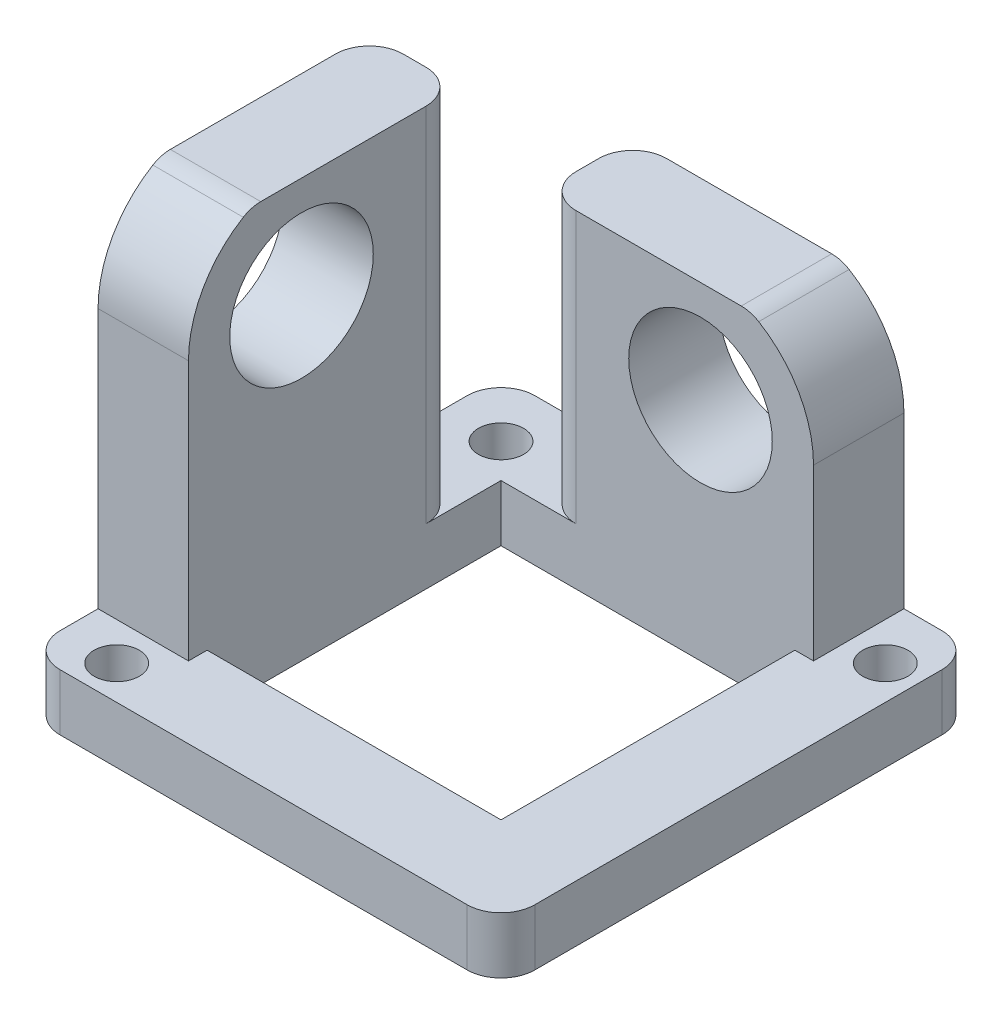
ISO-10303-21;
HEADER;
FILE_DESCRIPTION(('STEP AP214'),'2;1');
FILE_NAME('part.step','',(''),(''),'','','');
FILE_SCHEMA(('AUTOMOTIVE_DESIGN { 1 0 10303 214 1 1 1 1 }'));
ENDSEC;
DATA;
#1=APPLICATION_CONTEXT('core data for automotive mechanical design processes');
#2=APPLICATION_PROTOCOL_DEFINITION('international standard','automotive_design',2000,#1);
#3=PRODUCT_CONTEXT('',#1,'mechanical');
#4=PRODUCT('Part','Part','',(#3));
#5=PRODUCT_RELATED_PRODUCT_CATEGORY('part','',(#4));
#6=PRODUCT_DEFINITION_FORMATION('','',#4);
#7=PRODUCT_DEFINITION_CONTEXT('part definition',#1,'design');
#8=PRODUCT_DEFINITION('design','',#6,#7);
#9=PRODUCT_DEFINITION_SHAPE('','',#8);
#10=(LENGTH_UNIT() NAMED_UNIT(*) SI_UNIT(.MILLI.,.METRE.));
#11=(NAMED_UNIT(*) PLANE_ANGLE_UNIT() SI_UNIT($,.RADIAN.));
#12=(NAMED_UNIT(*) SI_UNIT($,.STERADIAN.) SOLID_ANGLE_UNIT());
#13=UNCERTAINTY_MEASURE_WITH_UNIT(LENGTH_MEASURE(1.E-05),#10,'distance_accuracy_value','');
#14=(GEOMETRIC_REPRESENTATION_CONTEXT(3) GLOBAL_UNCERTAINTY_ASSIGNED_CONTEXT((#13)) GLOBAL_UNIT_ASSIGNED_CONTEXT((#10,
#11,#12)) REPRESENTATION_CONTEXT('',''));
#15=CARTESIAN_POINT('',(0.,0.,0.));
#16=DIRECTION('',(0.,0.,1.));
#17=DIRECTION('',(1.,0.,0.));
#18=AXIS2_PLACEMENT_3D('',#15,#16,#17);
#19=CARTESIAN_POINT('',(0.,5.,-3.00000000000002));
#20=DIRECTION('',(1.,0.,0.));
#21=DIRECTION('',(0.,0.,-1.));
#22=AXIS2_PLACEMENT_3D('',#19,#20,#21);
#23=PLANE('',#22);
#24=CARTESIAN_POINT('',(0.,28.,-16.35));
#25=DIRECTION('',(1.,0.,0.));
#26=DIRECTION('',(0.,0.,-1.));
#27=AXIS2_PLACEMENT_3D('',#24,#25,#26);
#28=CIRCLE('',#27,6.35);
#29=CARTESIAN_POINT('',(0.,28.,-22.7));
#30=VERTEX_POINT('',#29);
#31=EDGE_CURVE('E534',#30,#30,#28,.F.);
#32=ORIENTED_EDGE('',*,*,#31,.F.);
#33=EDGE_LOOP('',(#32));
#34=FACE_BOUND('',#33,.T.);
#35=CARTESIAN_POINT('',(0.,28.,-16.35));
#36=DIRECTION('',(1.,0.,0.));
#37=DIRECTION('',(0.,0.,-1.));
#38=AXIS2_PLACEMENT_3D('',#35,#36,#37);
#39=CIRCLE('',#38,10.);
#40=CARTESIAN_POINT('',(0.,28.,-6.34999999999999));
#41=VERTEX_POINT('',#40);
#42=CARTESIAN_POINT('',(0.,36.5714285714286,-11.1992124636229));
#43=VERTEX_POINT('',#42);
#44=EDGE_CURVE('E255',#41,#43,#39,.F.);
#45=ORIENTED_EDGE('',*,*,#44,.T.);
#46=CARTESIAN_POINT('',(0.,34.,-12.744448724536));
#47=DIRECTION('',(1.,0.,0.));
#48=DIRECTION('',(0.,0.,-1.));
#49=AXIS2_PLACEMENT_3D('',#46,#47,#48);
#50=CIRCLE('',#49,3.);
#51=CARTESIAN_POINT('',(0.,37.,-12.744448724536));
#52=VERTEX_POINT('',#51);
#53=EDGE_CURVE('E444',#43,#52,#50,.F.);
#54=ORIENTED_EDGE('',*,*,#53,.T.);
#55=DIRECTION('',(0.,0.,1.));
#56=VECTOR('',#55,1.);
#57=CARTESIAN_POINT('',(0.,37.,0.));
#58=LINE('',#57,#56);
#59=CARTESIAN_POINT('',(0.,37.,-27.35));
#60=VERTEX_POINT('',#59);
#61=EDGE_CURVE('E274',#60,#52,#58,.T.);
#62=ORIENTED_EDGE('',*,*,#61,.F.);
#63=DIRECTION('',(0.,-1.,0.));
#64=VECTOR('',#63,1.);
#65=CARTESIAN_POINT('',(0.,5.,-27.35));
#66=LINE('',#65,#64);
#67=CARTESIAN_POINT('',(0.,5.,-27.35));
#68=VERTEX_POINT('',#67);
#69=EDGE_CURVE('E441',#60,#68,#66,.T.);
#70=ORIENTED_EDGE('',*,*,#69,.T.);
#71=DIRECTION('',(0.,0.,1.));
#72=VECTOR('',#71,1.);
#73=CARTESIAN_POINT('',(0.,5.,-3.00000000000002));
#74=LINE('',#73,#72);
#75=CARTESIAN_POINT('',(0.,5.,-39.));
#76=VERTEX_POINT('',#75);
#77=EDGE_CURVE('E353',#76,#68,#74,.T.);
#78=ORIENTED_EDGE('',*,*,#77,.F.);
#79=DIRECTION('',(0.,-1.,0.));
#80=VECTOR('',#79,1.);
#81=CARTESIAN_POINT('',(0.,5.,-39.));
#82=LINE('',#81,#80);
#83=CARTESIAN_POINT('',(0.,0.,-39.));
#84=VERTEX_POINT('',#83);
#85=EDGE_CURVE('E292',#76,#84,#82,.T.);
#86=ORIENTED_EDGE('',*,*,#85,.T.);
#87=DIRECTION('',(0.,0.,1.));
#88=VECTOR('',#87,1.);
#89=CARTESIAN_POINT('',(0.,0.,-3.00000000000002));
#90=LINE('',#89,#88);
#91=CARTESIAN_POINT('',(0.,0.,-3.00000000000002));
#92=VERTEX_POINT('',#91);
#93=EDGE_CURVE('E372',#84,#92,#90,.T.);
#94=ORIENTED_EDGE('',*,*,#93,.T.);
#95=DIRECTION('',(0.,-1.,0.));
#96=VECTOR('',#95,1.);
#97=CARTESIAN_POINT('',(0.,5.,-3.00000000000002));
#98=LINE('',#97,#96);
#99=CARTESIAN_POINT('',(0.,5.,-3.00000000000002));
#100=VERTEX_POINT('',#99);
#101=EDGE_CURVE('E402',#100,#92,#98,.T.);
#102=ORIENTED_EDGE('',*,*,#101,.F.);
#103=CARTESIAN_POINT('',(0.,5.,-6.34999999999999));
#104=VERTEX_POINT('',#103);
#105=EDGE_CURVE('E351',#104,#100,#74,.T.);
#106=ORIENTED_EDGE('',*,*,#105,.F.);
#107=DIRECTION('',(0.,-1.,0.));
#108=VECTOR('',#107,1.);
#109=CARTESIAN_POINT('',(0.,37.,-6.34999999999999));
#110=LINE('',#109,#108);
#111=EDGE_CURVE('E269',#41,#104,#110,.T.);
#112=ORIENTED_EDGE('',*,*,#111,.F.);
#113=EDGE_LOOP('',(#45,#54,#62,#70,#78,#86,#94,#102,#106,#112));
#114=FACE_BOUND('',#113,.T.);
#115=ADVANCED_FACE('F60',(#34,#114),#23,.F.);
#116=CARTESIAN_POINT('',(8.,5.,-34.));
#117=DIRECTION('',(1.,0.,0.));
#118=DIRECTION('',(0.,0.,-1.));
#119=AXIS2_PLACEMENT_3D('',#116,#117,#118);
#120=PLANE('',#119);
#121=CARTESIAN_POINT('',(8.,28.,-16.35));
#122=DIRECTION('',(1.,0.,0.));
#123=DIRECTION('',(0.,0.,-1.));
#124=AXIS2_PLACEMENT_3D('',#121,#122,#123);
#125=CIRCLE('',#124,6.35);
#126=CARTESIAN_POINT('',(8.,28.,-22.7));
#127=VERTEX_POINT('',#126);
#128=EDGE_CURVE('E262',#127,#127,#125,.T.);
#129=ORIENTED_EDGE('',*,*,#128,.F.);
#130=EDGE_LOOP('',(#129));
#131=FACE_BOUND('',#130,.T.);
#132=DIRECTION('',(0.,0.,1.));
#133=VECTOR('',#132,1.);
#134=CARTESIAN_POINT('',(8.,37.,0.));
#135=LINE('',#134,#133);
#136=CARTESIAN_POINT('',(8.,37.,-27.35));
#137=VERTEX_POINT('',#136);
#138=CARTESIAN_POINT('',(8.,37.,-12.744448724536));
#139=VERTEX_POINT('',#138);
#140=EDGE_CURVE('E515',#137,#139,#135,.T.);
#141=ORIENTED_EDGE('',*,*,#140,.T.);
#142=CARTESIAN_POINT('',(8.,34.,-12.744448724536));
#143=DIRECTION('',(1.,0.,0.));
#144=DIRECTION('',(0.,0.,-1.));
#145=AXIS2_PLACEMENT_3D('',#142,#143,#144);
#146=CIRCLE('',#145,3.);
#147=CARTESIAN_POINT('',(8.,36.5714285714286,-11.1992124636229));
#148=VERTEX_POINT('',#147);
#149=EDGE_CURVE('E251',#139,#148,#146,.T.);
#150=ORIENTED_EDGE('',*,*,#149,.T.);
#151=CARTESIAN_POINT('',(8.,28.,-16.35));
#152=DIRECTION('',(1.,0.,0.));
#153=DIRECTION('',(0.,0.,-1.));
#154=AXIS2_PLACEMENT_3D('',#151,#152,#153);
#155=CIRCLE('',#154,10.);
#156=CARTESIAN_POINT('',(8.00000000000001,28.,-6.34999999999999));
#157=VERTEX_POINT('',#156);
#158=EDGE_CURVE('E244',#148,#157,#155,.T.);
#159=ORIENTED_EDGE('',*,*,#158,.T.);
#160=DIRECTION('',(0.,-1.,0.));
#161=VECTOR('',#160,1.);
#162=CARTESIAN_POINT('',(8.,37.,-6.34999999999999));
#163=LINE('',#162,#161);
#164=CARTESIAN_POINT('',(8.,5.,-6.34999999999999));
#165=VERTEX_POINT('',#164);
#166=EDGE_CURVE('E249',#157,#165,#163,.T.);
#167=ORIENTED_EDGE('',*,*,#166,.T.);
#168=DIRECTION('',(0.,0.,1.));
#169=VECTOR('',#168,1.);
#170=CARTESIAN_POINT('',(8.,5.,0.));
#171=LINE('',#170,#169);
#172=CARTESIAN_POINT('',(8.,5.,-8.));
#173=VERTEX_POINT('',#172);
#174=EDGE_CURVE('E522',#173,#165,#171,.T.);
#175=ORIENTED_EDGE('',*,*,#174,.F.);
#176=DIRECTION('',(0.,-1.,0.));
#177=VECTOR('',#176,1.);
#178=CARTESIAN_POINT('',(8.,5.,-8.));
#179=LINE('',#178,#177);
#180=CARTESIAN_POINT('',(8.,0.,-8.));
#181=VERTEX_POINT('',#180);
#182=EDGE_CURVE('E326',#173,#181,#179,.T.);
#183=ORIENTED_EDGE('',*,*,#182,.T.);
#184=DIRECTION('',(0.,0.,1.));
#185=VECTOR('',#184,1.);
#186=CARTESIAN_POINT('',(8.,0.,-34.));
#187=LINE('',#186,#185);
#188=CARTESIAN_POINT('',(8.,0.,-34.));
#189=VERTEX_POINT('',#188);
#190=EDGE_CURVE('E298',#189,#181,#187,.T.);
#191=ORIENTED_EDGE('',*,*,#190,.F.);
#192=DIRECTION('',(0.,-1.,0.));
#193=VECTOR('',#192,1.);
#194=CARTESIAN_POINT('',(8.,5.,-34.));
#195=LINE('',#194,#193);
#196=CARTESIAN_POINT('',(8.,5.,-34.));
#197=VERTEX_POINT('',#196);
#198=EDGE_CURVE('E309',#197,#189,#195,.T.);
#199=ORIENTED_EDGE('',*,*,#198,.F.);
#200=DIRECTION('',(0.,0.,1.));
#201=VECTOR('',#200,1.);
#202=CARTESIAN_POINT('',(8.,5.,-34.));
#203=LINE('',#202,#201);
#204=CARTESIAN_POINT('',(8.,5.,-27.35));
#205=VERTEX_POINT('',#204);
#206=EDGE_CURVE('E299',#197,#205,#203,.T.);
#207=ORIENTED_EDGE('',*,*,#206,.T.);
#208=DIRECTION('',(0.,-1.,0.));
#209=VECTOR('',#208,1.);
#210=CARTESIAN_POINT('',(8.,5.,-27.35));
#211=LINE('',#210,#209);
#212=EDGE_CURVE('E436',#205,#137,#211,.F.);
#213=ORIENTED_EDGE('',*,*,#212,.T.);
#214=EDGE_LOOP('',(#141,#150,#159,#167,#175,#183,#191,#199,#207,#213));
#215=FACE_BOUND('',#214,.T.);
#216=ADVANCED_FACE('F247',(#131,#215),#120,.T.);
#217=CARTESIAN_POINT('',(0.,37.,0.));
#218=DIRECTION('',(0.,1.,0.));
#219=DIRECTION('',(0.,0.,1.));
#220=AXIS2_PLACEMENT_3D('',#217,#218,#219);
#221=PLANE('',#220);
#222=ORIENTED_EDGE('',*,*,#61,.T.);
#223=DIRECTION('',(1.,0.,0.));
#224=VECTOR('',#223,1.);
#225=CARTESIAN_POINT('',(0.,37.,-12.744448724536));
#226=LINE('',#225,#224);
#227=EDGE_CURVE('E433',#52,#139,#226,.T.);
#228=ORIENTED_EDGE('',*,*,#227,.T.);
#229=ORIENTED_EDGE('',*,*,#140,.F.);
#230=CARTESIAN_POINT('',(5.,37.,-27.35));
#231=DIRECTION('',(0.,1.,0.));
#232=DIRECTION('',(0.,0.,1.));
#233=AXIS2_PLACEMENT_3D('',#230,#231,#232);
#234=CIRCLE('',#233,3.);
#235=CARTESIAN_POINT('',(5.,37.,-30.35));
#236=VERTEX_POINT('',#235);
#237=EDGE_CURVE('E429',#137,#236,#234,.T.);
#238=ORIENTED_EDGE('',*,*,#237,.T.);
#239=DIRECTION('',(1.,0.,0.));
#240=VECTOR('',#239,1.);
#241=CARTESIAN_POINT('',(0.,37.,-30.35));
#242=LINE('',#241,#240);
#243=CARTESIAN_POINT('',(3.,37.,-30.35));
#244=VERTEX_POINT('',#243);
#245=EDGE_CURVE('E508',#244,#236,#242,.T.);
#246=ORIENTED_EDGE('',*,*,#245,.F.);
#247=CARTESIAN_POINT('',(3.,37.,-27.35));
#248=DIRECTION('',(0.,1.,0.));
#249=DIRECTION('',(0.,0.,1.));
#250=AXIS2_PLACEMENT_3D('',#247,#248,#249);
#251=CIRCLE('',#250,3.);
#252=EDGE_CURVE('E431',#244,#60,#251,.T.);
#253=ORIENTED_EDGE('',*,*,#252,.T.);
#254=EDGE_LOOP('',(#222,#228,#229,#238,#246,#253));
#255=FACE_BOUND('',#254,.T.);
#256=ADVANCED_FACE('F512',(#255),#221,.T.);
#257=CARTESIAN_POINT('',(3.00000000000002,5.,-42.));
#258=DIRECTION('',(0.,0.,1.));
#259=DIRECTION('',(1.,0.,0.));
#260=AXIS2_PLACEMENT_3D('',#257,#258,#259);
#261=PLANE('',#260);
#262=CARTESIAN_POINT('',(25.65,20.,-42.));
#263=DIRECTION('',(0.,0.,-1.));
#264=DIRECTION('',(-1.,0.,0.));
#265=AXIS2_PLACEMENT_3D('',#262,#263,#264);
#266=CIRCLE('',#265,6.35);
#267=CARTESIAN_POINT('',(19.3,20.,-42.));
#268=VERTEX_POINT('',#267);
#269=EDGE_CURVE('E523',#268,#268,#266,.T.);
#270=ORIENTED_EDGE('',*,*,#269,.F.);
#271=EDGE_LOOP('',(#270));
#272=FACE_BOUND('',#271,.T.);
#273=DIRECTION('',(-1.,0.,0.));
#274=VECTOR('',#273,1.);
#275=CARTESIAN_POINT('',(0.,29.,-42.));
#276=LINE('',#275,#274);
#277=CARTESIAN_POINT('',(29.255551275464,29.,-42.));
#278=VERTEX_POINT('',#277);
#279=CARTESIAN_POINT('',(14.65,29.,-42.));
#280=VERTEX_POINT('',#279);
#281=EDGE_CURVE('E284',#278,#280,#276,.T.);
#282=ORIENTED_EDGE('',*,*,#281,.F.);
#283=CARTESIAN_POINT('',(29.255551275464,26.,-42.));
#284=DIRECTION('',(0.,0.,1.));
#285=DIRECTION('',(1.,0.,0.));
#286=AXIS2_PLACEMENT_3D('',#283,#284,#285);
#287=CIRCLE('',#286,3.);
#288=CARTESIAN_POINT('',(30.8007875363771,28.5714285714286,-42.));
#289=VERTEX_POINT('',#288);
#290=EDGE_CURVE('E415',#278,#289,#287,.F.);
#291=ORIENTED_EDGE('',*,*,#290,.T.);
#292=CARTESIAN_POINT('',(25.65,20.,-42.));
#293=DIRECTION('',(0.,0.,-1.));
#294=DIRECTION('',(-1.,0.,0.));
#295=AXIS2_PLACEMENT_3D('',#292,#293,#294);
#296=CIRCLE('',#295,10.);
#297=CARTESIAN_POINT('',(35.65,20.,-42.));
#298=VERTEX_POINT('',#297);
#299=EDGE_CURVE('E538',#289,#298,#296,.T.);
#300=ORIENTED_EDGE('',*,*,#299,.T.);
#301=DIRECTION('',(0.,-1.,0.));
#302=VECTOR('',#301,1.);
#303=CARTESIAN_POINT('',(35.65,29.,-42.));
#304=LINE('',#303,#302);
#305=CARTESIAN_POINT('',(35.65,5.,-42.));
#306=VERTEX_POINT('',#305);
#307=EDGE_CURVE('E286',#298,#306,#304,.T.);
#308=ORIENTED_EDGE('',*,*,#307,.T.);
#309=DIRECTION('',(-1.,0.,0.));
#310=VECTOR('',#309,1.);
#311=CARTESIAN_POINT('',(3.00000000000002,5.,-42.));
#312=LINE('',#311,#310);
#313=CARTESIAN_POINT('',(39.,5.,-42.));
#314=VERTEX_POINT('',#313);
#315=EDGE_CURVE('E366',#314,#306,#312,.T.);
#316=ORIENTED_EDGE('',*,*,#315,.F.);
#317=DIRECTION('',(0.,-1.,0.));
#318=VECTOR('',#317,1.);
#319=CARTESIAN_POINT('',(39.,5.,-42.));
#320=LINE('',#319,#318);
#321=CARTESIAN_POINT('',(39.,0.,-42.));
#322=VERTEX_POINT('',#321);
#323=EDGE_CURVE('E387',#314,#322,#320,.T.);
#324=ORIENTED_EDGE('',*,*,#323,.T.);
#325=DIRECTION('',(-1.,0.,0.));
#326=VECTOR('',#325,1.);
#327=CARTESIAN_POINT('',(3.00000000000002,0.,-42.));
#328=LINE('',#327,#326);
#329=CARTESIAN_POINT('',(3.00000000000002,0.,-42.));
#330=VERTEX_POINT('',#329);
#331=EDGE_CURVE('E352',#322,#330,#328,.T.);
#332=ORIENTED_EDGE('',*,*,#331,.T.);
#333=DIRECTION('',(0.,-1.,0.));
#334=VECTOR('',#333,1.);
#335=CARTESIAN_POINT('',(3.00000000000002,5.,-42.));
#336=LINE('',#335,#334);
#337=CARTESIAN_POINT('',(3.00000000000002,5.,-42.));
#338=VERTEX_POINT('',#337);
#339=EDGE_CURVE('E369',#338,#330,#336,.T.);
#340=ORIENTED_EDGE('',*,*,#339,.F.);
#341=CARTESIAN_POINT('',(14.65,5.,-42.));
#342=VERTEX_POINT('',#341);
#343=EDGE_CURVE('E365',#342,#338,#312,.T.);
#344=ORIENTED_EDGE('',*,*,#343,.F.);
#345=DIRECTION('',(0.,-1.,0.));
#346=VECTOR('',#345,1.);
#347=CARTESIAN_POINT('',(14.65,29.,-42.));
#348=LINE('',#347,#346);
#349=EDGE_CURVE('E413',#342,#280,#348,.F.);
#350=ORIENTED_EDGE('',*,*,#349,.T.);
#351=EDGE_LOOP('',(#282,#291,#300,#308,#316,#324,#332,#340,#344,#350));
#352=FACE_BOUND('',#351,.T.);
#353=ADVANCED_FACE('F484',(#272,#352),#261,.F.);
#354=CARTESIAN_POINT('',(8.,5.,-34.));
#355=DIRECTION('',(0.,0.,1.));
#356=DIRECTION('',(1.,0.,0.));
#357=AXIS2_PLACEMENT_3D('',#354,#355,#356);
#358=PLANE('',#357);
#359=CARTESIAN_POINT('',(25.65,20.,-34.));
#360=DIRECTION('',(0.,0.,1.));
#361=DIRECTION('',(1.,0.,0.));
#362=AXIS2_PLACEMENT_3D('',#359,#360,#361);
#363=CIRCLE('',#362,6.35);
#364=CARTESIAN_POINT('',(32.,20.,-34.));
#365=VERTEX_POINT('',#364);
#366=EDGE_CURVE('E543',#365,#365,#363,.F.);
#367=ORIENTED_EDGE('',*,*,#366,.T.);
#368=EDGE_LOOP('',(#367));
#369=FACE_BOUND('',#368,.T.);
#370=CARTESIAN_POINT('',(25.65,20.,-34.));
#371=DIRECTION('',(0.,0.,1.));
#372=DIRECTION('',(1.,0.,0.));
#373=AXIS2_PLACEMENT_3D('',#370,#371,#372);
#374=CIRCLE('',#373,10.);
#375=CARTESIAN_POINT('',(30.8007875363771,28.5714285714286,-34.));
#376=VERTEX_POINT('',#375);
#377=CARTESIAN_POINT('',(35.65,20.,-34.));
#378=VERTEX_POINT('',#377);
#379=EDGE_CURVE('E477',#376,#378,#374,.F.);
#380=ORIENTED_EDGE('',*,*,#379,.F.);
#381=CARTESIAN_POINT('',(29.255551275464,26.,-34.));
#382=DIRECTION('',(0.,0.,1.));
#383=DIRECTION('',(1.,0.,0.));
#384=AXIS2_PLACEMENT_3D('',#381,#382,#383);
#385=CIRCLE('',#384,3.);
#386=CARTESIAN_POINT('',(29.255551275464,29.,-34.));
#387=VERTEX_POINT('',#386);
#388=EDGE_CURVE('E422',#376,#387,#385,.T.);
#389=ORIENTED_EDGE('',*,*,#388,.T.);
#390=DIRECTION('',(1.,0.,0.));
#391=VECTOR('',#390,1.);
#392=CARTESIAN_POINT('',(0.,29.,-34.));
#393=LINE('',#392,#391);
#394=CARTESIAN_POINT('',(14.65,29.,-34.));
#395=VERTEX_POINT('',#394);
#396=EDGE_CURVE('E281',#395,#387,#393,.T.);
#397=ORIENTED_EDGE('',*,*,#396,.F.);
#398=DIRECTION('',(0.,-1.,0.));
#399=VECTOR('',#398,1.);
#400=CARTESIAN_POINT('',(14.65,5.,-34.));
#401=LINE('',#400,#399);
#402=CARTESIAN_POINT('',(14.65,5.,-34.));
#403=VERTEX_POINT('',#402);
#404=EDGE_CURVE('E419',#395,#403,#401,.T.);
#405=ORIENTED_EDGE('',*,*,#404,.T.);
#406=DIRECTION('',(-1.,0.,0.));
#407=VECTOR('',#406,1.);
#408=CARTESIAN_POINT('',(8.,5.,-34.));
#409=LINE('',#408,#407);
#410=EDGE_CURVE('E307',#403,#197,#409,.T.);
#411=ORIENTED_EDGE('',*,*,#410,.T.);
#412=ORIENTED_EDGE('',*,*,#198,.T.);
#413=DIRECTION('',(-1.,0.,0.));
#414=VECTOR('',#413,1.);
#415=CARTESIAN_POINT('',(8.,0.,-34.));
#416=LINE('',#415,#414);
#417=CARTESIAN_POINT('',(34.,0.,-34.));
#418=VERTEX_POINT('',#417);
#419=EDGE_CURVE('E302',#418,#189,#416,.T.);
#420=ORIENTED_EDGE('',*,*,#419,.F.);
#421=DIRECTION('',(0.,-1.,0.));
#422=VECTOR('',#421,1.);
#423=CARTESIAN_POINT('',(34.,5.,-34.));
#424=LINE('',#423,#422);
#425=CARTESIAN_POINT('',(34.,5.,-34.));
#426=VERTEX_POINT('',#425);
#427=EDGE_CURVE('E322',#426,#418,#424,.T.);
#428=ORIENTED_EDGE('',*,*,#427,.F.);
#429=DIRECTION('',(1.,0.,0.));
#430=VECTOR('',#429,1.);
#431=CARTESIAN_POINT('',(0.,5.,-34.));
#432=LINE('',#431,#430);
#433=CARTESIAN_POINT('',(35.65,5.,-34.));
#434=VERTEX_POINT('',#433);
#435=EDGE_CURVE('E288',#426,#434,#432,.T.);
#436=ORIENTED_EDGE('',*,*,#435,.T.);
#437=DIRECTION('',(0.,-1.,0.));
#438=VECTOR('',#437,1.);
#439=CARTESIAN_POINT('',(35.65,29.,-34.));
#440=LINE('',#439,#438);
#441=EDGE_CURVE('E296',#378,#434,#440,.T.);
#442=ORIENTED_EDGE('',*,*,#441,.F.);
#443=EDGE_LOOP('',(#380,#389,#397,#405,#411,#412,#420,#428,#436,#442));
#444=FACE_BOUND('',#443,.T.);
#445=ADVANCED_FACE('F474',(#369,#444),#358,.T.);
#446=CARTESIAN_POINT('',(0.,29.,0.));
#447=DIRECTION('',(0.,1.,0.));
#448=DIRECTION('',(0.,0.,1.));
#449=AXIS2_PLACEMENT_3D('',#446,#447,#448);
#450=PLANE('',#449);
#451=ORIENTED_EDGE('',*,*,#396,.T.);
#452=DIRECTION('',(0.,0.,-1.));
#453=VECTOR('',#452,1.);
#454=CARTESIAN_POINT('',(29.255551275464,29.,0.));
#455=LINE('',#454,#453);
#456=EDGE_CURVE('E410',#387,#278,#455,.T.);
#457=ORIENTED_EDGE('',*,*,#456,.T.);
#458=ORIENTED_EDGE('',*,*,#281,.T.);
#459=CARTESIAN_POINT('',(14.65,29.,-39.));
#460=DIRECTION('',(0.,1.,0.));
#461=DIRECTION('',(0.,0.,1.));
#462=AXIS2_PLACEMENT_3D('',#459,#460,#461);
#463=CIRCLE('',#462,3.);
#464=CARTESIAN_POINT('',(11.65,29.,-39.));
#465=VERTEX_POINT('',#464);
#466=EDGE_CURVE('E408',#280,#465,#463,.T.);
#467=ORIENTED_EDGE('',*,*,#466,.T.);
#468=DIRECTION('',(0.,0.,-1.));
#469=VECTOR('',#468,1.);
#470=CARTESIAN_POINT('',(11.65,29.,0.));
#471=LINE('',#470,#469);
#472=CARTESIAN_POINT('',(11.65,29.,-37.));
#473=VERTEX_POINT('',#472);
#474=EDGE_CURVE('E278',#473,#465,#471,.T.);
#475=ORIENTED_EDGE('',*,*,#474,.F.);
#476=CARTESIAN_POINT('',(14.65,29.,-37.));
#477=DIRECTION('',(0.,1.,0.));
#478=DIRECTION('',(0.,0.,1.));
#479=AXIS2_PLACEMENT_3D('',#476,#477,#478);
#480=CIRCLE('',#479,3.);
#481=EDGE_CURVE('E291',#473,#395,#480,.T.);
#482=ORIENTED_EDGE('',*,*,#481,.T.);
#483=EDGE_LOOP('',(#451,#457,#458,#467,#475,#482));
#484=FACE_BOUND('',#483,.T.);
#485=ADVANCED_FACE('F470',(#484),#450,.T.);
#486=CARTESIAN_POINT('',(3.,5.,-39.));
#487=DIRECTION('',(0.,1.,0.));
#488=DIRECTION('',(0.,0.,1.));
#489=AXIS2_PLACEMENT_3D('',#486,#487,#488);
#490=PLANE('',#489);
#491=DIRECTION('',(-1.,0.,0.));
#492=VECTOR('',#491,1.);
#493=CARTESIAN_POINT('',(0.,5.,-6.34999999999999));
#494=LINE('',#493,#492);
#495=EDGE_CURVE('E266',#165,#104,#494,.T.);
#496=ORIENTED_EDGE('',*,*,#495,.T.);
#497=ORIENTED_EDGE('',*,*,#105,.T.);
#498=CARTESIAN_POINT('',(3.,5.,-3.));
#499=DIRECTION('',(0.,1.,0.));
#500=DIRECTION('',(0.,0.,-1.));
#501=AXIS2_PLACEMENT_3D('',#498,#499,#500);
#502=CIRCLE('',#501,3.);
#503=CARTESIAN_POINT('',(3.00000000000002,5.,0.));
#504=VERTEX_POINT('',#503);
#505=EDGE_CURVE('E355',#100,#504,#502,.T.);
#506=ORIENTED_EDGE('',*,*,#505,.T.);
#507=DIRECTION('',(1.,0.,0.));
#508=VECTOR('',#507,1.);
#509=CARTESIAN_POINT('',(3.00000000000002,5.,0.));
#510=LINE('',#509,#508);
#511=CARTESIAN_POINT('',(39.,5.,0.));
#512=VERTEX_POINT('',#511);
#513=EDGE_CURVE('E357',#504,#512,#510,.T.);
#514=ORIENTED_EDGE('',*,*,#513,.T.);
#515=CARTESIAN_POINT('',(39.,5.,-3.));
#516=DIRECTION('',(0.,1.,0.));
#517=DIRECTION('',(0.,0.,-1.));
#518=AXIS2_PLACEMENT_3D('',#515,#516,#517);
#519=CIRCLE('',#518,3.);
#520=CARTESIAN_POINT('',(42.,5.,-3.00000000000002));
#521=VERTEX_POINT('',#520);
#522=EDGE_CURVE('E359',#512,#521,#519,.T.);
#523=ORIENTED_EDGE('',*,*,#522,.T.);
#524=DIRECTION('',(0.,0.,-1.));
#525=VECTOR('',#524,1.);
#526=CARTESIAN_POINT('',(42.,5.,-3.00000000000002));
#527=LINE('',#526,#525);
#528=CARTESIAN_POINT('',(42.,5.,-39.));
#529=VERTEX_POINT('',#528);
#530=EDGE_CURVE('E361',#521,#529,#527,.T.);
#531=ORIENTED_EDGE('',*,*,#530,.T.);
#532=CARTESIAN_POINT('',(39.,5.,-39.));
#533=DIRECTION('',(0.,1.,0.));
#534=DIRECTION('',(0.,0.,1.));
#535=AXIS2_PLACEMENT_3D('',#532,#533,#534);
#536=CIRCLE('',#535,3.);
#537=EDGE_CURVE('E363',#529,#314,#536,.T.);
#538=ORIENTED_EDGE('',*,*,#537,.T.);
#539=ORIENTED_EDGE('',*,*,#315,.T.);
#540=DIRECTION('',(0.,0.,1.));
#541=VECTOR('',#540,1.);
#542=CARTESIAN_POINT('',(35.65,5.,0.));
#543=LINE('',#542,#541);
#544=EDGE_CURVE('E272',#306,#434,#543,.T.);
#545=ORIENTED_EDGE('',*,*,#544,.T.);
#546=ORIENTED_EDGE('',*,*,#435,.F.);
#547=DIRECTION('',(0.,0.,-1.));
#548=VECTOR('',#547,1.);
#549=CARTESIAN_POINT('',(34.,5.,-34.));
#550=LINE('',#549,#548);
#551=CARTESIAN_POINT('',(34.,5.,-8.));
#552=VERTEX_POINT('',#551);
#553=EDGE_CURVE('E304',#552,#426,#550,.T.);
#554=ORIENTED_EDGE('',*,*,#553,.F.);
#555=DIRECTION('',(1.,0.,0.));
#556=VECTOR('',#555,1.);
#557=CARTESIAN_POINT('',(8.,5.,-8.));
#558=LINE('',#557,#556);
#559=EDGE_CURVE('E301',#173,#552,#558,.T.);
#560=ORIENTED_EDGE('',*,*,#559,.F.);
#561=ORIENTED_EDGE('',*,*,#174,.T.);
#562=EDGE_LOOP('',(#496,#497,#506,#514,#523,#531,#538,#539,#545,#546,#554,#560,#561));
#563=FACE_BOUND('',#562,.T.);
#564=CARTESIAN_POINT('',(5.,5.,-3.));
#565=DIRECTION('',(0.,1.,0.));
#566=DIRECTION('',(0.,0.,1.));
#567=AXIS2_PLACEMENT_3D('',#564,#565,#566);
#568=CIRCLE('',#567,2.);
#569=CARTESIAN_POINT('',(5.,5.,-1.));
#570=VERTEX_POINT('',#569);
#571=EDGE_CURVE('E330',#570,#570,#568,.T.);
#572=ORIENTED_EDGE('',*,*,#571,.F.);
#573=EDGE_LOOP('',(#572));
#574=FACE_BOUND('',#573,.T.);
#575=CARTESIAN_POINT('',(39.,5.,-37.));
#576=DIRECTION('',(0.,1.,0.));
#577=DIRECTION('',(0.,0.,1.));
#578=AXIS2_PLACEMENT_3D('',#575,#576,#577);
#579=CIRCLE('',#578,2.);
#580=CARTESIAN_POINT('',(39.,5.,-35.));
#581=VERTEX_POINT('',#580);
#582=EDGE_CURVE('E342',#581,#581,#579,.T.);
#583=ORIENTED_EDGE('',*,*,#582,.F.);
#584=EDGE_LOOP('',(#583));
#585=FACE_BOUND('',#584,.T.);
#586=ADVANCED_FACE('F679',(#563,#574,#585),#490,.T.);
#587=ORIENTED_EDGE('',*,*,#77,.T.);
#588=CARTESIAN_POINT('',(3.,5.,-27.35));
#589=DIRECTION('',(0.,1.,0.));
#590=DIRECTION('',(0.,0.,1.));
#591=AXIS2_PLACEMENT_3D('',#588,#589,#590);
#592=CIRCLE('',#591,3.);
#593=CARTESIAN_POINT('',(3.,5.,-30.35));
#594=VERTEX_POINT('',#593);
#595=EDGE_CURVE('E68',#68,#594,#592,.F.);
#596=ORIENTED_EDGE('',*,*,#595,.T.);
#597=DIRECTION('',(1.,0.,0.));
#598=VECTOR('',#597,1.);
#599=CARTESIAN_POINT('',(0.,5.,-30.35));
#600=LINE('',#599,#598);
#601=CARTESIAN_POINT('',(5.,5.,-30.35));
#602=VERTEX_POINT('',#601);
#603=EDGE_CURVE('E509',#594,#602,#600,.T.);
#604=ORIENTED_EDGE('',*,*,#603,.T.);
#605=CARTESIAN_POINT('',(5.,5.,-27.35));
#606=DIRECTION('',(0.,1.,0.));
#607=DIRECTION('',(0.,0.,1.));
#608=AXIS2_PLACEMENT_3D('',#605,#606,#607);
#609=CIRCLE('',#608,3.);
#610=EDGE_CURVE('E12',#602,#205,#609,.F.);
#611=ORIENTED_EDGE('',*,*,#610,.T.);
#612=ORIENTED_EDGE('',*,*,#206,.F.);
#613=ORIENTED_EDGE('',*,*,#410,.F.);
#614=CARTESIAN_POINT('',(14.65,5.,-37.));
#615=DIRECTION('',(0.,1.,0.));
#616=DIRECTION('',(0.,0.,1.));
#617=AXIS2_PLACEMENT_3D('',#614,#615,#616);
#618=CIRCLE('',#617,3.);
#619=CARTESIAN_POINT('',(11.65,5.,-37.));
#620=VERTEX_POINT('',#619);
#621=EDGE_CURVE('E453',#403,#620,#618,.F.);
#622=ORIENTED_EDGE('',*,*,#621,.T.);
#623=DIRECTION('',(0.,0.,-1.));
#624=VECTOR('',#623,1.);
#625=CARTESIAN_POINT('',(11.65,5.,0.));
#626=LINE('',#625,#624);
#627=CARTESIAN_POINT('',(11.65,5.,-39.));
#628=VERTEX_POINT('',#627);
#629=EDGE_CURVE('E268',#620,#628,#626,.T.);
#630=ORIENTED_EDGE('',*,*,#629,.T.);
#631=CARTESIAN_POINT('',(14.65,5.,-39.));
#632=DIRECTION('',(0.,1.,0.));
#633=DIRECTION('',(0.,0.,1.));
#634=AXIS2_PLACEMENT_3D('',#631,#632,#633);
#635=CIRCLE('',#634,3.);
#636=EDGE_CURVE('E450',#628,#342,#635,.F.);
#637=ORIENTED_EDGE('',*,*,#636,.T.);
#638=ORIENTED_EDGE('',*,*,#343,.T.);
#639=CARTESIAN_POINT('',(3.,5.,-39.));
#640=DIRECTION('',(0.,1.,0.));
#641=DIRECTION('',(0.,0.,1.));
#642=AXIS2_PLACEMENT_3D('',#639,#640,#641);
#643=CIRCLE('',#642,3.);
#644=EDGE_CURVE('E348',#338,#76,#643,.T.);
#645=ORIENTED_EDGE('',*,*,#644,.T.);
#646=EDGE_LOOP('',(#587,#596,#604,#611,#612,#613,#622,#630,#637,#638,#645));
#647=FACE_BOUND('',#646,.T.);
#648=CARTESIAN_POINT('',(5.,5.,-37.));
#649=DIRECTION('',(0.,1.,0.));
#650=DIRECTION('',(0.,0.,1.));
#651=AXIS2_PLACEMENT_3D('',#648,#649,#650);
#652=CIRCLE('',#651,2.);
#653=CARTESIAN_POINT('',(5.,5.,-35.));
#654=VERTEX_POINT('',#653);
#655=EDGE_CURVE('E336',#654,#654,#652,.T.);
#656=ORIENTED_EDGE('',*,*,#655,.F.);
#657=EDGE_LOOP('',(#656));
#658=FACE_BOUND('',#657,.T.);
#659=ADVANCED_FACE('F456',(#647,#658),#490,.T.);
#660=CARTESIAN_POINT('',(3.,0.,-39.));
#661=DIRECTION('',(0.,1.,0.));
#662=DIRECTION('',(0.,0.,1.));
#663=AXIS2_PLACEMENT_3D('',#660,#661,#662);
#664=PLANE('',#663);
#665=CARTESIAN_POINT('',(5.,0.,-3.));
#666=DIRECTION('',(0.,1.,0.));
#667=DIRECTION('',(0.,0.,1.));
#668=AXIS2_PLACEMENT_3D('',#665,#666,#667);
#669=CIRCLE('',#668,2.);
#670=CARTESIAN_POINT('',(5.,0.,-1.));
#671=VERTEX_POINT('',#670);
#672=EDGE_CURVE('E329',#671,#671,#669,.T.);
#673=ORIENTED_EDGE('',*,*,#672,.T.);
#674=EDGE_LOOP('',(#673));
#675=FACE_BOUND('',#674,.T.);
#676=CARTESIAN_POINT('',(5.,0.,-37.));
#677=DIRECTION('',(0.,1.,0.));
#678=DIRECTION('',(0.,0.,1.));
#679=AXIS2_PLACEMENT_3D('',#676,#677,#678);
#680=CIRCLE('',#679,2.);
#681=CARTESIAN_POINT('',(5.,0.,-35.));
#682=VERTEX_POINT('',#681);
#683=EDGE_CURVE('E333',#682,#682,#680,.T.);
#684=ORIENTED_EDGE('',*,*,#683,.T.);
#685=EDGE_LOOP('',(#684));
#686=FACE_BOUND('',#685,.T.);
#687=CARTESIAN_POINT('',(39.,0.,-37.));
#688=DIRECTION('',(0.,1.,0.));
#689=DIRECTION('',(0.,0.,1.));
#690=AXIS2_PLACEMENT_3D('',#687,#688,#689);
#691=CIRCLE('',#690,2.);
#692=CARTESIAN_POINT('',(39.,0.,-35.));
#693=VERTEX_POINT('',#692);
#694=EDGE_CURVE('E339',#693,#693,#691,.T.);
#695=ORIENTED_EDGE('',*,*,#694,.T.);
#696=EDGE_LOOP('',(#695));
#697=FACE_BOUND('',#696,.T.);
#698=CARTESIAN_POINT('',(3.,0.,-39.));
#699=DIRECTION('',(0.,1.,0.));
#700=DIRECTION('',(0.,0.,1.));
#701=AXIS2_PLACEMENT_3D('',#698,#699,#700);
#702=CIRCLE('',#701,3.);
#703=EDGE_CURVE('E345',#330,#84,#702,.T.);
#704=ORIENTED_EDGE('',*,*,#703,.F.);
#705=ORIENTED_EDGE('',*,*,#331,.F.);
#706=CARTESIAN_POINT('',(39.,0.,-39.));
#707=DIRECTION('',(0.,1.,0.));
#708=DIRECTION('',(0.,0.,1.));
#709=AXIS2_PLACEMENT_3D('',#706,#707,#708);
#710=CIRCLE('',#709,3.);
#711=CARTESIAN_POINT('',(42.,0.,-39.));
#712=VERTEX_POINT('',#711);
#713=EDGE_CURVE('E382',#712,#322,#710,.T.);
#714=ORIENTED_EDGE('',*,*,#713,.F.);
#715=DIRECTION('',(0.,0.,-1.));
#716=VECTOR('',#715,1.);
#717=CARTESIAN_POINT('',(42.,0.,-3.00000000000002));
#718=LINE('',#717,#716);
#719=CARTESIAN_POINT('',(42.,0.,-3.00000000000002));
#720=VERTEX_POINT('',#719);
#721=EDGE_CURVE('E380',#720,#712,#718,.T.);
#722=ORIENTED_EDGE('',*,*,#721,.F.);
#723=CARTESIAN_POINT('',(39.,0.,-3.));
#724=DIRECTION('',(0.,1.,0.));
#725=DIRECTION('',(0.,0.,-1.));
#726=AXIS2_PLACEMENT_3D('',#723,#724,#725);
#727=CIRCLE('',#726,3.);
#728=CARTESIAN_POINT('',(39.,0.,0.));
#729=VERTEX_POINT('',#728);
#730=EDGE_CURVE('E378',#729,#720,#727,.T.);
#731=ORIENTED_EDGE('',*,*,#730,.F.);
#732=DIRECTION('',(1.,0.,0.));
#733=VECTOR('',#732,1.);
#734=CARTESIAN_POINT('',(3.00000000000002,0.,0.));
#735=LINE('',#734,#733);
#736=CARTESIAN_POINT('',(3.00000000000002,0.,0.));
#737=VERTEX_POINT('',#736);
#738=EDGE_CURVE('E376',#737,#729,#735,.T.);
#739=ORIENTED_EDGE('',*,*,#738,.F.);
#740=CARTESIAN_POINT('',(3.,0.,-3.));
#741=DIRECTION('',(0.,1.,0.));
#742=DIRECTION('',(0.,0.,-1.));
#743=AXIS2_PLACEMENT_3D('',#740,#741,#742);
#744=CIRCLE('',#743,3.);
#745=EDGE_CURVE('E374',#92,#737,#744,.T.);
#746=ORIENTED_EDGE('',*,*,#745,.F.);
#747=ORIENTED_EDGE('',*,*,#93,.F.);
#748=EDGE_LOOP('',(#704,#705,#714,#722,#731,#739,#746,#747));
#749=FACE_BOUND('',#748,.T.);
#750=ORIENTED_EDGE('',*,*,#190,.T.);
#751=DIRECTION('',(1.,0.,0.));
#752=VECTOR('',#751,1.);
#753=CARTESIAN_POINT('',(8.,0.,-8.));
#754=LINE('',#753,#752);
#755=CARTESIAN_POINT('',(34.,0.,-8.));
#756=VERTEX_POINT('',#755);
#757=EDGE_CURVE('E312',#181,#756,#754,.T.);
#758=ORIENTED_EDGE('',*,*,#757,.T.);
#759=DIRECTION('',(0.,0.,-1.));
#760=VECTOR('',#759,1.);
#761=CARTESIAN_POINT('',(34.,0.,-34.));
#762=LINE('',#761,#760);
#763=EDGE_CURVE('E315',#756,#418,#762,.T.);
#764=ORIENTED_EDGE('',*,*,#763,.T.);
#765=ORIENTED_EDGE('',*,*,#419,.T.);
#766=EDGE_LOOP('',(#750,#758,#764,#765));
#767=FACE_BOUND('',#766,.T.);
#768=ADVANCED_FACE('F581',(#675,#686,#697,#749,#767),#664,.F.);
#769=CARTESIAN_POINT('',(3.,5.,-39.));
#770=DIRECTION('',(0.,-1.,0.));
#771=DIRECTION('',(0.,0.,-1.));
#772=AXIS2_PLACEMENT_3D('',#769,#770,#771);
#773=CYLINDRICAL_SURFACE('',#772,3.);
#774=ORIENTED_EDGE('',*,*,#703,.T.);
#775=ORIENTED_EDGE('',*,*,#85,.F.);
#776=ORIENTED_EDGE('',*,*,#644,.F.);
#777=ORIENTED_EDGE('',*,*,#339,.T.);
#778=EDGE_LOOP('',(#774,#775,#776,#777));
#779=FACE_BOUND('',#778,.T.);
#780=ADVANCED_FACE('F495',(#779),#773,.T.);
#781=CARTESIAN_POINT('',(3.,5.,-3.));
#782=DIRECTION('',(0.,-1.,0.));
#783=DIRECTION('',(0.,0.,-1.));
#784=AXIS2_PLACEMENT_3D('',#781,#782,#783);
#785=CYLINDRICAL_SURFACE('',#784,3.);
#786=ORIENTED_EDGE('',*,*,#745,.T.);
#787=DIRECTION('',(0.,-1.,0.));
#788=VECTOR('',#787,1.);
#789=CARTESIAN_POINT('',(3.00000000000002,5.,0.));
#790=LINE('',#789,#788);
#791=EDGE_CURVE('E399',#504,#737,#790,.T.);
#792=ORIENTED_EDGE('',*,*,#791,.F.);
#793=ORIENTED_EDGE('',*,*,#505,.F.);
#794=ORIENTED_EDGE('',*,*,#101,.T.);
#795=EDGE_LOOP('',(#786,#792,#793,#794));
#796=FACE_BOUND('',#795,.T.);
#797=ADVANCED_FACE('F577',(#796),#785,.T.);
#798=CARTESIAN_POINT('',(3.00000000000002,5.,0.));
#799=DIRECTION('',(0.,0.,-1.));
#800=DIRECTION('',(-1.,0.,0.));
#801=AXIS2_PLACEMENT_3D('',#798,#799,#800);
#802=PLANE('',#801);
#803=ORIENTED_EDGE('',*,*,#738,.T.);
#804=DIRECTION('',(0.,-1.,0.));
#805=VECTOR('',#804,1.);
#806=CARTESIAN_POINT('',(39.,5.,0.));
#807=LINE('',#806,#805);
#808=EDGE_CURVE('E396',#512,#729,#807,.T.);
#809=ORIENTED_EDGE('',*,*,#808,.F.);
#810=ORIENTED_EDGE('',*,*,#513,.F.);
#811=ORIENTED_EDGE('',*,*,#791,.T.);
#812=EDGE_LOOP('',(#803,#809,#810,#811));
#813=FACE_BOUND('',#812,.T.);
#814=ADVANCED_FACE('F829',(#813),#802,.F.);
#815=CARTESIAN_POINT('',(39.,5.,-3.));
#816=DIRECTION('',(0.,-1.,0.));
#817=DIRECTION('',(0.,0.,-1.));
#818=AXIS2_PLACEMENT_3D('',#815,#816,#817);
#819=CYLINDRICAL_SURFACE('',#818,3.);
#820=ORIENTED_EDGE('',*,*,#730,.T.);
#821=DIRECTION('',(0.,-1.,0.));
#822=VECTOR('',#821,1.);
#823=CARTESIAN_POINT('',(42.,5.,-3.00000000000002));
#824=LINE('',#823,#822);
#825=EDGE_CURVE('E393',#521,#720,#824,.T.);
#826=ORIENTED_EDGE('',*,*,#825,.F.);
#827=ORIENTED_EDGE('',*,*,#522,.F.);
#828=ORIENTED_EDGE('',*,*,#808,.T.);
#829=EDGE_LOOP('',(#820,#826,#827,#828));
#830=FACE_BOUND('',#829,.T.);
#831=ADVANCED_FACE('F819',(#830),#819,.T.);
#832=CARTESIAN_POINT('',(42.,5.,-3.00000000000002));
#833=DIRECTION('',(-1.,0.,0.));
#834=DIRECTION('',(0.,0.,1.));
#835=AXIS2_PLACEMENT_3D('',#832,#833,#834);
#836=PLANE('',#835);
#837=ORIENTED_EDGE('',*,*,#721,.T.);
#838=DIRECTION('',(0.,-1.,0.));
#839=VECTOR('',#838,1.);
#840=CARTESIAN_POINT('',(42.,5.,-39.));
#841=LINE('',#840,#839);
#842=EDGE_CURVE('E390',#529,#712,#841,.T.);
#843=ORIENTED_EDGE('',*,*,#842,.F.);
#844=ORIENTED_EDGE('',*,*,#530,.F.);
#845=ORIENTED_EDGE('',*,*,#825,.T.);
#846=EDGE_LOOP('',(#837,#843,#844,#845));
#847=FACE_BOUND('',#846,.T.);
#848=ADVANCED_FACE('F810',(#847),#836,.F.);
#849=CARTESIAN_POINT('',(39.,5.,-39.));
#850=DIRECTION('',(0.,-1.,0.));
#851=DIRECTION('',(0.,0.,-1.));
#852=AXIS2_PLACEMENT_3D('',#849,#850,#851);
#853=CYLINDRICAL_SURFACE('',#852,3.);
#854=ORIENTED_EDGE('',*,*,#713,.T.);
#855=ORIENTED_EDGE('',*,*,#323,.F.);
#856=ORIENTED_EDGE('',*,*,#537,.F.);
#857=ORIENTED_EDGE('',*,*,#842,.T.);
#858=EDGE_LOOP('',(#854,#855,#856,#857));
#859=FACE_BOUND('',#858,.T.);
#860=ADVANCED_FACE('F800',(#859),#853,.T.);
#861=CARTESIAN_POINT('',(39.,5.,-37.));
#862=DIRECTION('',(0.,-1.,0.));
#863=DIRECTION('',(0.,0.,-1.));
#864=AXIS2_PLACEMENT_3D('',#861,#862,#863);
#865=CYLINDRICAL_SURFACE('',#864,2.);
#866=ORIENTED_EDGE('',*,*,#582,.T.);
#867=EDGE_LOOP('',(#866));
#868=FACE_BOUND('',#867,.T.);
#869=ORIENTED_EDGE('',*,*,#694,.F.);
#870=EDGE_LOOP('',(#869));
#871=FACE_BOUND('',#870,.T.);
#872=ADVANCED_FACE('F790',(#868,#871),#865,.F.);
#873=CARTESIAN_POINT('',(5.,5.,-37.));
#874=DIRECTION('',(0.,-1.,0.));
#875=DIRECTION('',(0.,0.,-1.));
#876=AXIS2_PLACEMENT_3D('',#873,#874,#875);
#877=CYLINDRICAL_SURFACE('',#876,2.);
#878=ORIENTED_EDGE('',*,*,#655,.T.);
#879=EDGE_LOOP('',(#878));
#880=FACE_BOUND('',#879,.T.);
#881=ORIENTED_EDGE('',*,*,#683,.F.);
#882=EDGE_LOOP('',(#881));
#883=FACE_BOUND('',#882,.T.);
#884=ADVANCED_FACE('F780',(#880,#883),#877,.F.);
#885=CARTESIAN_POINT('',(5.,5.,-3.));
#886=DIRECTION('',(0.,-1.,0.));
#887=DIRECTION('',(0.,0.,-1.));
#888=AXIS2_PLACEMENT_3D('',#885,#886,#887);
#889=CYLINDRICAL_SURFACE('',#888,2.);
#890=ORIENTED_EDGE('',*,*,#571,.T.);
#891=EDGE_LOOP('',(#890));
#892=FACE_BOUND('',#891,.T.);
#893=ORIENTED_EDGE('',*,*,#672,.F.);
#894=EDGE_LOOP('',(#893));
#895=FACE_BOUND('',#894,.T.);
#896=ADVANCED_FACE('F757',(#892,#895),#889,.F.);
#897=CARTESIAN_POINT('',(8.,5.,-8.));
#898=DIRECTION('',(0.,0.,-1.));
#899=DIRECTION('',(-1.,0.,0.));
#900=AXIS2_PLACEMENT_3D('',#897,#898,#899);
#901=PLANE('',#900);
#902=ORIENTED_EDGE('',*,*,#757,.F.);
#903=ORIENTED_EDGE('',*,*,#182,.F.);
#904=ORIENTED_EDGE('',*,*,#559,.T.);
#905=DIRECTION('',(0.,-1.,0.));
#906=VECTOR('',#905,1.);
#907=CARTESIAN_POINT('',(34.,5.,-8.));
#908=LINE('',#907,#906);
#909=EDGE_CURVE('E324',#552,#756,#908,.T.);
#910=ORIENTED_EDGE('',*,*,#909,.T.);
#911=EDGE_LOOP('',(#902,#903,#904,#910));
#912=FACE_BOUND('',#911,.T.);
#913=ADVANCED_FACE('F752',(#912),#901,.T.);
#914=CARTESIAN_POINT('',(34.,5.,-34.));
#915=DIRECTION('',(-1.,0.,0.));
#916=DIRECTION('',(0.,0.,1.));
#917=AXIS2_PLACEMENT_3D('',#914,#915,#916);
#918=PLANE('',#917);
#919=ORIENTED_EDGE('',*,*,#763,.F.);
#920=ORIENTED_EDGE('',*,*,#909,.F.);
#921=ORIENTED_EDGE('',*,*,#553,.T.);
#922=ORIENTED_EDGE('',*,*,#427,.T.);
#923=EDGE_LOOP('',(#919,#920,#921,#922));
#924=FACE_BOUND('',#923,.T.);
#925=ADVANCED_FACE('F667',(#924),#918,.T.);
#926=CARTESIAN_POINT('',(11.65,29.,0.));
#927=DIRECTION('',(-1.,0.,0.));
#928=DIRECTION('',(0.,0.,1.));
#929=AXIS2_PLACEMENT_3D('',#926,#927,#928);
#930=PLANE('',#929);
#931=ORIENTED_EDGE('',*,*,#474,.T.);
#932=DIRECTION('',(0.,-1.,0.));
#933=VECTOR('',#932,1.);
#934=CARTESIAN_POINT('',(11.65,5.,-39.));
#935=LINE('',#934,#933);
#936=EDGE_CURVE('E426',#465,#628,#935,.T.);
#937=ORIENTED_EDGE('',*,*,#936,.T.);
#938=ORIENTED_EDGE('',*,*,#629,.F.);
#939=DIRECTION('',(0.,-1.,0.));
#940=VECTOR('',#939,1.);
#941=CARTESIAN_POINT('',(11.65,29.,-37.));
#942=LINE('',#941,#940);
#943=EDGE_CURVE('E424',#620,#473,#942,.F.);
#944=ORIENTED_EDGE('',*,*,#943,.T.);
#945=EDGE_LOOP('',(#931,#937,#938,#944));
#946=FACE_BOUND('',#945,.T.);
#947=ADVANCED_FACE('F463',(#946),#930,.T.);
#948=CARTESIAN_POINT('',(35.65,29.,0.));
#949=DIRECTION('',(1.,0.,0.));
#950=DIRECTION('',(0.,0.,-1.));
#951=AXIS2_PLACEMENT_3D('',#948,#949,#950);
#952=PLANE('',#951);
#953=DIRECTION('',(0.,0.,-1.));
#954=VECTOR('',#953,1.);
#955=CARTESIAN_POINT('',(35.65,20.,0.001000000000001));
#956=LINE('',#955,#954);
#957=EDGE_CURVE('E540',#378,#298,#956,.T.);
#958=ORIENTED_EDGE('',*,*,#957,.F.);
#959=ORIENTED_EDGE('',*,*,#441,.T.);
#960=ORIENTED_EDGE('',*,*,#544,.F.);
#961=ORIENTED_EDGE('',*,*,#307,.F.);
#962=EDGE_LOOP('',(#958,#959,#960,#961));
#963=FACE_BOUND('',#962,.T.);
#964=ADVANCED_FACE('F666',(#963),#952,.T.);
#965=CARTESIAN_POINT('',(0.,37.,-6.34999999999999));
#966=DIRECTION('',(0.,0.,1.));
#967=DIRECTION('',(1.,0.,0.));
#968=AXIS2_PLACEMENT_3D('',#965,#966,#967);
#969=PLANE('',#968);
#970=DIRECTION('',(1.,0.,0.));
#971=VECTOR('',#970,1.);
#972=CARTESIAN_POINT('',(-0.001000000000001,28.,-6.34999999999999));
#973=LINE('',#972,#971);
#974=EDGE_CURVE('E254',#41,#157,#973,.T.);
#975=ORIENTED_EDGE('',*,*,#974,.F.);
#976=ORIENTED_EDGE('',*,*,#111,.T.);
#977=ORIENTED_EDGE('',*,*,#495,.F.);
#978=ORIENTED_EDGE('',*,*,#166,.F.);
#979=EDGE_LOOP('',(#975,#976,#977,#978));
#980=FACE_BOUND('',#979,.T.);
#981=ADVANCED_FACE('F264',(#980),#969,.T.);
#982=CARTESIAN_POINT('',(0.,37.,-30.35));
#983=DIRECTION('',(0.,0.,-1.));
#984=DIRECTION('',(-1.,0.,0.));
#985=AXIS2_PLACEMENT_3D('',#982,#983,#984);
#986=PLANE('',#985);
#987=ORIENTED_EDGE('',*,*,#603,.F.);
#988=DIRECTION('',(0.,-1.,0.));
#989=VECTOR('',#988,1.);
#990=CARTESIAN_POINT('',(3.,37.,-30.35));
#991=LINE('',#990,#989);
#992=EDGE_CURVE('E448',#594,#244,#991,.F.);
#993=ORIENTED_EDGE('',*,*,#992,.T.);
#994=ORIENTED_EDGE('',*,*,#245,.T.);
#995=DIRECTION('',(0.,-1.,0.));
#996=VECTOR('',#995,1.);
#997=CARTESIAN_POINT('',(5.,37.,-30.35));
#998=LINE('',#997,#996);
#999=EDGE_CURVE('E446',#236,#602,#998,.T.);
#1000=ORIENTED_EDGE('',*,*,#999,.T.);
#1001=EDGE_LOOP('',(#987,#993,#994,#1000));
#1002=FACE_BOUND('',#1001,.T.);
#1003=ADVANCED_FACE('F507',(#1002),#986,.T.);
#1004=CARTESIAN_POINT('',(25.65,20.,0.001000000000001));
#1005=DIRECTION('',(0.,0.,-1.));
#1006=DIRECTION('',(-1.,0.,0.));
#1007=AXIS2_PLACEMENT_3D('',#1004,#1005,#1006);
#1008=CYLINDRICAL_SURFACE('',#1007,10.);
#1009=ORIENTED_EDGE('',*,*,#299,.F.);
#1010=DIRECTION('',(0.,0.,-1.));
#1011=VECTOR('',#1010,1.);
#1012=CARTESIAN_POINT('',(30.8007875363771,28.5714285714286,0.001000000000001));
#1013=LINE('',#1012,#1011);
#1014=EDGE_CURVE('E417',#289,#376,#1013,.F.);
#1015=ORIENTED_EDGE('',*,*,#1014,.T.);
#1016=ORIENTED_EDGE('',*,*,#379,.T.);
#1017=ORIENTED_EDGE('',*,*,#957,.T.);
#1018=EDGE_LOOP('',(#1009,#1015,#1016,#1017));
#1019=FACE_BOUND('',#1018,.T.);
#1020=ADVANCED_FACE('F552',(#1019),#1008,.T.);
#1021=CARTESIAN_POINT('',(25.65,20.,0.001000000000001));
#1022=DIRECTION('',(0.,0.,-1.));
#1023=DIRECTION('',(-1.,0.,0.));
#1024=AXIS2_PLACEMENT_3D('',#1021,#1022,#1023);
#1025=CYLINDRICAL_SURFACE('',#1024,6.35);
#1026=ORIENTED_EDGE('',*,*,#366,.F.);
#1027=EDGE_LOOP('',(#1026));
#1028=FACE_BOUND('',#1027,.T.);
#1029=ORIENTED_EDGE('',*,*,#269,.T.);
#1030=EDGE_LOOP('',(#1029));
#1031=FACE_BOUND('',#1030,.T.);
#1032=ADVANCED_FACE('F549',(#1028,#1031),#1025,.F.);
#1033=CARTESIAN_POINT('',(-0.00100000000000273,28.,-16.35));
#1034=DIRECTION('',(1.,0.,0.));
#1035=DIRECTION('',(0.,0.,-1.));
#1036=AXIS2_PLACEMENT_3D('',#1033,#1034,#1035);
#1037=CYLINDRICAL_SURFACE('',#1036,10.);
#1038=ORIENTED_EDGE('',*,*,#158,.F.);
#1039=DIRECTION('',(1.,0.,0.));
#1040=VECTOR('',#1039,1.);
#1041=CARTESIAN_POINT('',(-0.00100000000000205,36.5714285714286,-11.1992124636229));
#1042=LINE('',#1041,#1040);
#1043=EDGE_CURVE('E439',#148,#43,#1042,.F.);
#1044=ORIENTED_EDGE('',*,*,#1043,.T.);
#1045=ORIENTED_EDGE('',*,*,#44,.F.);
#1046=ORIENTED_EDGE('',*,*,#974,.T.);
#1047=EDGE_LOOP('',(#1038,#1044,#1045,#1046));
#1048=FACE_BOUND('',#1047,.T.);
#1049=ADVANCED_FACE('F258',(#1048),#1037,.T.);
#1050=CARTESIAN_POINT('',(-0.00100000000000273,28.,-16.35));
#1051=DIRECTION('',(1.,0.,0.));
#1052=DIRECTION('',(0.,0.,-1.));
#1053=AXIS2_PLACEMENT_3D('',#1050,#1051,#1052);
#1054=CYLINDRICAL_SURFACE('',#1053,6.35);
#1055=ORIENTED_EDGE('',*,*,#128,.T.);
#1056=EDGE_LOOP('',(#1055));
#1057=FACE_BOUND('',#1056,.T.);
#1058=ORIENTED_EDGE('',*,*,#31,.T.);
#1059=EDGE_LOOP('',(#1058));
#1060=FACE_BOUND('',#1059,.T.);
#1061=ADVANCED_FACE('F584',(#1057,#1060),#1054,.F.);
#1062=CARTESIAN_POINT('',(29.255551275464,26.,0.001000000000001));
#1063=DIRECTION('',(0.,0.,-1.));
#1064=DIRECTION('',(-1.,0.,0.));
#1065=AXIS2_PLACEMENT_3D('',#1062,#1063,#1064);
#1066=CYLINDRICAL_SURFACE('',#1065,3.);
#1067=ORIENTED_EDGE('',*,*,#388,.F.);
#1068=ORIENTED_EDGE('',*,*,#1014,.F.);
#1069=ORIENTED_EDGE('',*,*,#290,.F.);
#1070=ORIENTED_EDGE('',*,*,#456,.F.);
#1071=EDGE_LOOP('',(#1067,#1068,#1069,#1070));
#1072=FACE_BOUND('',#1071,.T.);
#1073=ADVANCED_FACE('F480',(#1072),#1066,.T.);
#1074=CARTESIAN_POINT('',(14.65,29.,-39.));
#1075=DIRECTION('',(0.,1.,0.));
#1076=DIRECTION('',(0.,0.,1.));
#1077=AXIS2_PLACEMENT_3D('',#1074,#1075,#1076);
#1078=CYLINDRICAL_SURFACE('',#1077,3.);
#1079=ORIENTED_EDGE('',*,*,#466,.F.);
#1080=ORIENTED_EDGE('',*,*,#349,.F.);
#1081=ORIENTED_EDGE('',*,*,#636,.F.);
#1082=ORIENTED_EDGE('',*,*,#936,.F.);
#1083=EDGE_LOOP('',(#1079,#1080,#1081,#1082));
#1084=FACE_BOUND('',#1083,.T.);
#1085=ADVANCED_FACE('F489',(#1084),#1078,.T.);
#1086=CARTESIAN_POINT('',(14.65,5.,-37.));
#1087=DIRECTION('',(0.,-1.,0.));
#1088=DIRECTION('',(0.,0.,-1.));
#1089=AXIS2_PLACEMENT_3D('',#1086,#1087,#1088);
#1090=CYLINDRICAL_SURFACE('',#1089,3.);
#1091=ORIENTED_EDGE('',*,*,#481,.F.);
#1092=ORIENTED_EDGE('',*,*,#943,.F.);
#1093=ORIENTED_EDGE('',*,*,#621,.F.);
#1094=ORIENTED_EDGE('',*,*,#404,.F.);
#1095=EDGE_LOOP('',(#1091,#1092,#1093,#1094));
#1096=FACE_BOUND('',#1095,.T.);
#1097=ADVANCED_FACE('F467',(#1096),#1090,.T.);
#1098=CARTESIAN_POINT('',(-0.00100000000000225,34.,-12.744448724536));
#1099=DIRECTION('',(1.,0.,0.));
#1100=DIRECTION('',(0.,0.,-1.));
#1101=AXIS2_PLACEMENT_3D('',#1098,#1099,#1100);
#1102=CYLINDRICAL_SURFACE('',#1101,3.);
#1103=ORIENTED_EDGE('',*,*,#53,.F.);
#1104=ORIENTED_EDGE('',*,*,#1043,.F.);
#1105=ORIENTED_EDGE('',*,*,#149,.F.);
#1106=ORIENTED_EDGE('',*,*,#227,.F.);
#1107=EDGE_LOOP('',(#1103,#1104,#1105,#1106));
#1108=FACE_BOUND('',#1107,.T.);
#1109=ADVANCED_FACE('F528',(#1108),#1102,.T.);
#1110=CARTESIAN_POINT('',(3.,5.,-27.35));
#1111=DIRECTION('',(0.,1.,0.));
#1112=DIRECTION('',(0.,0.,1.));
#1113=AXIS2_PLACEMENT_3D('',#1110,#1111,#1112);
#1114=CYLINDRICAL_SURFACE('',#1113,3.);
#1115=ORIENTED_EDGE('',*,*,#252,.F.);
#1116=ORIENTED_EDGE('',*,*,#992,.F.);
#1117=ORIENTED_EDGE('',*,*,#595,.F.);
#1118=ORIENTED_EDGE('',*,*,#69,.F.);
#1119=EDGE_LOOP('',(#1115,#1116,#1117,#1118));
#1120=FACE_BOUND('',#1119,.T.);
#1121=ADVANCED_FACE('F503',(#1120),#1114,.T.);
#1122=CARTESIAN_POINT('',(5.,37.,-27.35));
#1123=DIRECTION('',(0.,-1.,0.));
#1124=DIRECTION('',(0.,0.,-1.));
#1125=AXIS2_PLACEMENT_3D('',#1122,#1123,#1124);
#1126=CYLINDRICAL_SURFACE('',#1125,3.);
#1127=ORIENTED_EDGE('',*,*,#237,.F.);
#1128=ORIENTED_EDGE('',*,*,#212,.F.);
#1129=ORIENTED_EDGE('',*,*,#610,.F.);
#1130=ORIENTED_EDGE('',*,*,#999,.F.);
#1131=EDGE_LOOP('',(#1127,#1128,#1129,#1130));
#1132=FACE_BOUND('',#1131,.T.);
#1133=ADVANCED_FACE('F62',(#1132),#1126,.T.);
#1134=CLOSED_SHELL('',(#115,#216,#256,#353,#445,#485,#586,#659,#768,#780,#797,#814,#831,#848,
#860,#872,#884,#896,#913,#925,#947,#964,#981,#1003,#1020,#1032,#1049,#1061,#1073,#1085,#1097,
#1109,#1121,#1133));
#1135=MANIFOLD_SOLID_BREP('B2',#1134);
#1136=ADVANCED_BREP_SHAPE_REPRESENTATION('',(#18,#1135),#14);
#1137=SHAPE_DEFINITION_REPRESENTATION(#9,#1136);
ENDSEC;
END-ISO-10303-21;
